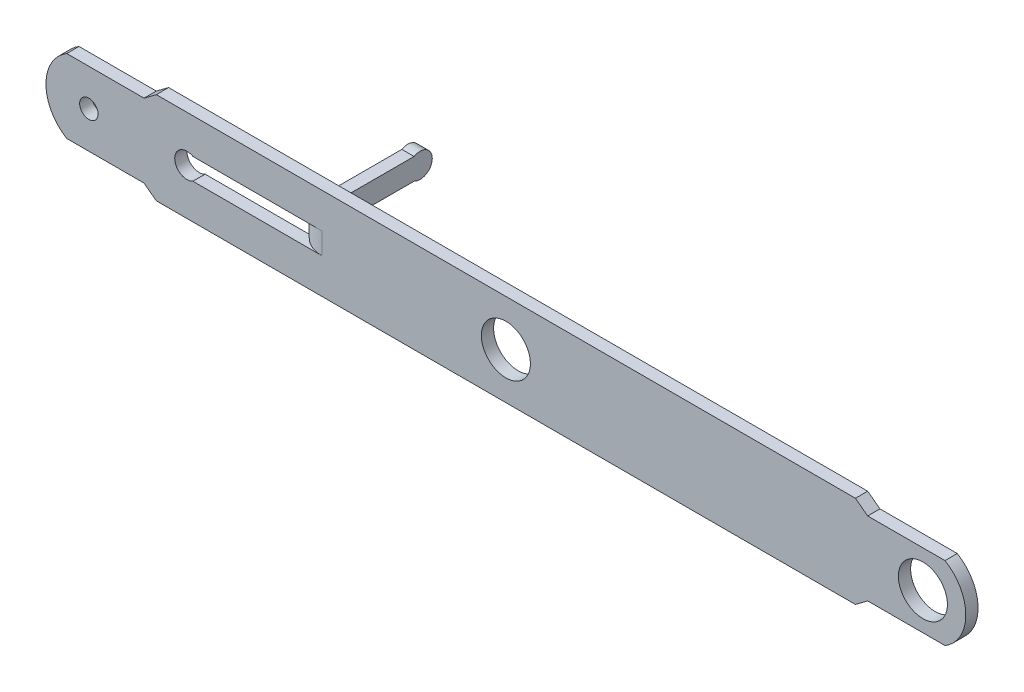
ISO-10303-21;
HEADER;
FILE_DESCRIPTION(('STEP AP214'),'2;1');
FILE_NAME('part.step','',(''),(''),'','','');
FILE_SCHEMA(('AUTOMOTIVE_DESIGN { 1 0 10303 214 1 1 1 1 }'));
ENDSEC;
DATA;
#1=APPLICATION_CONTEXT('core data for automotive mechanical design processes');
#2=APPLICATION_PROTOCOL_DEFINITION('international standard','automotive_design',2000,#1);
#3=PRODUCT_CONTEXT('',#1,'mechanical');
#4=PRODUCT('Part','Part','',(#3));
#5=PRODUCT_RELATED_PRODUCT_CATEGORY('part','',(#4));
#6=PRODUCT_DEFINITION_FORMATION('','',#4);
#7=PRODUCT_DEFINITION_CONTEXT('part definition',#1,'design');
#8=PRODUCT_DEFINITION('design','',#6,#7);
#9=PRODUCT_DEFINITION_SHAPE('','',#8);
#10=(LENGTH_UNIT() NAMED_UNIT(*) SI_UNIT(.MILLI.,.METRE.));
#11=(NAMED_UNIT(*) PLANE_ANGLE_UNIT() SI_UNIT($,.RADIAN.));
#12=(NAMED_UNIT(*) SI_UNIT($,.STERADIAN.) SOLID_ANGLE_UNIT());
#13=UNCERTAINTY_MEASURE_WITH_UNIT(LENGTH_MEASURE(1.E-05),#10,'distance_accuracy_value','');
#14=(GEOMETRIC_REPRESENTATION_CONTEXT(3) GLOBAL_UNCERTAINTY_ASSIGNED_CONTEXT((#13)) GLOBAL_UNIT_ASSIGNED_CONTEXT((#10,
#11,#12)) REPRESENTATION_CONTEXT('',''));
#15=CARTESIAN_POINT('',(0.,0.,0.));
#16=DIRECTION('',(0.,0.,1.));
#17=DIRECTION('',(1.,0.,0.));
#18=AXIS2_PLACEMENT_3D('',#15,#16,#17);
#19=CARTESIAN_POINT('',(-68.,0.,2.));
#20=DIRECTION('',(0.,0.,-1.));
#21=DIRECTION('',(-1.,0.,0.));
#22=AXIS2_PLACEMENT_3D('',#19,#20,#21);
#23=PLANE('',#22);
#24=DIRECTION('',(0.,-1.,0.));
#25=VECTOR('',#24,1.);
#26=CARTESIAN_POINT('',(-30.,0.,2.));
#27=LINE('',#26,#25);
#28=CARTESIAN_POINT('',(-30.,1.75,2.));
#29=VERTEX_POINT('',#28);
#30=CARTESIAN_POINT('',(-30.,-1.75,2.));
#31=VERTEX_POINT('',#30);
#32=EDGE_CURVE('E349',#29,#31,#27,.T.);
#33=ORIENTED_EDGE('',*,*,#32,.T.);
#34=DIRECTION('',(-1.,0.,0.));
#35=VECTOR('',#34,1.);
#36=CARTESIAN_POINT('',(-35.,-1.75,2.));
#37=LINE('',#36,#35);
#38=CARTESIAN_POINT('',(-51.0317541634481,-1.75,2.));
#39=VERTEX_POINT('',#38);
#40=EDGE_CURVE('E220',#31,#39,#37,.T.);
#41=ORIENTED_EDGE('',*,*,#40,.T.);
#42=CARTESIAN_POINT('',(-52.,0.,2.));
#43=DIRECTION('',(0.,0.,-1.));
#44=DIRECTION('',(-1.,0.,0.));
#45=AXIS2_PLACEMENT_3D('',#42,#43,#44);
#46=CIRCLE('',#45,2.);
#47=CARTESIAN_POINT('',(-51.0317541634481,1.75,2.));
#48=VERTEX_POINT('',#47);
#49=EDGE_CURVE('E223',#39,#48,#46,.T.);
#50=ORIENTED_EDGE('',*,*,#49,.T.);
#51=DIRECTION('',(1.,0.,0.));
#52=VECTOR('',#51,1.);
#53=CARTESIAN_POINT('',(-35.,1.75,2.));
#54=LINE('',#53,#52);
#55=EDGE_CURVE('E226',#48,#29,#54,.T.);
#56=ORIENTED_EDGE('',*,*,#55,.T.);
#57=EDGE_LOOP('',(#33,#41,#50,#56));
#58=FACE_BOUND('',#57,.T.);
#59=CARTESIAN_POINT('',(-68.,0.,2.));
#60=DIRECTION('',(0.,0.,1.));
#61=DIRECTION('',(1.,0.,0.));
#62=AXIS2_PLACEMENT_3D('',#59,#60,#61);
#63=CIRCLE('',#62,1.5);
#64=CARTESIAN_POINT('',(-66.5,0.,2.));
#65=VERTEX_POINT('',#64);
#66=EDGE_CURVE('E242',#65,#65,#63,.T.);
#67=ORIENTED_EDGE('',*,*,#66,.F.);
#68=EDGE_LOOP('',(#67));
#69=FACE_BOUND('',#68,.T.);
#70=DIRECTION('',(-1.,0.,0.));
#71=VECTOR('',#70,1.);
#72=CARTESIAN_POINT('',(57.,7.49999999999998,2.));
#73=LINE('',#72,#71);
#74=CARTESIAN_POINT('',(57.,7.49999999999998,2.));
#75=VERTEX_POINT('',#74);
#76=CARTESIAN_POINT('',(-57.,7.49999999999998,2.));
#77=VERTEX_POINT('',#76);
#78=EDGE_CURVE('E278',#75,#77,#73,.T.);
#79=ORIENTED_EDGE('',*,*,#78,.T.);
#80=DIRECTION('',(-0.800000000000002,-0.599999999999997,0.));
#81=VECTOR('',#80,1.);
#82=CARTESIAN_POINT('',(-59.,6.,2.));
#83=LINE('',#82,#81);
#84=CARTESIAN_POINT('',(-59.,6.,2.));
#85=VERTEX_POINT('',#84);
#86=EDGE_CURVE('E281',#77,#85,#83,.T.);
#87=ORIENTED_EDGE('',*,*,#86,.T.);
#88=DIRECTION('',(-1.,0.,0.));
#89=VECTOR('',#88,1.);
#90=CARTESIAN_POINT('',(-71.605551275464,5.99999999999999,2.));
#91=LINE('',#90,#89);
#92=CARTESIAN_POINT('',(-71.605551275464,5.99999999999999,2.));
#93=VERTEX_POINT('',#92);
#94=EDGE_CURVE('E283',#85,#93,#91,.T.);
#95=ORIENTED_EDGE('',*,*,#94,.T.);
#96=CARTESIAN_POINT('',(-68.,0.,2.));
#97=DIRECTION('',(0.,0.,1.));
#98=DIRECTION('',(-1.,0.,0.));
#99=AXIS2_PLACEMENT_3D('',#96,#97,#98);
#100=CIRCLE('',#99,7.);
#101=CARTESIAN_POINT('',(-71.605551275464,-5.99999999999999,2.));
#102=VERTEX_POINT('',#101);
#103=EDGE_CURVE('E285',#93,#102,#100,.T.);
#104=ORIENTED_EDGE('',*,*,#103,.T.);
#105=DIRECTION('',(1.,0.,0.));
#106=VECTOR('',#105,1.);
#107=CARTESIAN_POINT('',(-71.605551275464,-5.99999999999999,2.));
#108=LINE('',#107,#106);
#109=CARTESIAN_POINT('',(-59.,-6.,2.));
#110=VERTEX_POINT('',#109);
#111=EDGE_CURVE('E287',#102,#110,#108,.T.);
#112=ORIENTED_EDGE('',*,*,#111,.T.);
#113=DIRECTION('',(0.800000000000002,-0.599999999999997,0.));
#114=VECTOR('',#113,1.);
#115=CARTESIAN_POINT('',(-59.,-6.,2.));
#116=LINE('',#115,#114);
#117=CARTESIAN_POINT('',(-57.,-7.49999999999998,2.));
#118=VERTEX_POINT('',#117);
#119=EDGE_CURVE('E289',#110,#118,#116,.T.);
#120=ORIENTED_EDGE('',*,*,#119,.T.);
#121=DIRECTION('',(1.,0.,0.));
#122=VECTOR('',#121,1.);
#123=CARTESIAN_POINT('',(57.,-7.49999999999998,2.));
#124=LINE('',#123,#122);
#125=CARTESIAN_POINT('',(57.,-7.49999999999998,2.));
#126=VERTEX_POINT('',#125);
#127=EDGE_CURVE('E291',#118,#126,#124,.T.);
#128=ORIENTED_EDGE('',*,*,#127,.T.);
#129=DIRECTION('',(0.800000000000002,0.599999999999997,0.));
#130=VECTOR('',#129,1.);
#131=CARTESIAN_POINT('',(59.,-6.,2.));
#132=LINE('',#131,#130);
#133=CARTESIAN_POINT('',(59.,-6.,2.));
#134=VERTEX_POINT('',#133);
#135=EDGE_CURVE('E293',#126,#134,#132,.T.);
#136=ORIENTED_EDGE('',*,*,#135,.T.);
#137=DIRECTION('',(1.,0.,0.));
#138=VECTOR('',#137,1.);
#139=CARTESIAN_POINT('',(71.605551275464,-5.99999999999999,2.));
#140=LINE('',#139,#138);
#141=CARTESIAN_POINT('',(71.605551275464,-6.,2.));
#142=VERTEX_POINT('',#141);
#143=EDGE_CURVE('E295',#134,#142,#140,.T.);
#144=ORIENTED_EDGE('',*,*,#143,.T.);
#145=CARTESIAN_POINT('',(68.,0.,2.));
#146=DIRECTION('',(0.,0.,1.));
#147=DIRECTION('',(1.,0.,0.));
#148=AXIS2_PLACEMENT_3D('',#145,#146,#147);
#149=CIRCLE('',#148,7.);
#150=CARTESIAN_POINT('',(71.605551275464,5.99999999999999,2.));
#151=VERTEX_POINT('',#150);
#152=EDGE_CURVE('E297',#142,#151,#149,.T.);
#153=ORIENTED_EDGE('',*,*,#152,.T.);
#154=DIRECTION('',(-1.,0.,0.));
#155=VECTOR('',#154,1.);
#156=CARTESIAN_POINT('',(71.605551275464,5.99999999999999,2.));
#157=LINE('',#156,#155);
#158=CARTESIAN_POINT('',(59.,6.,2.));
#159=VERTEX_POINT('',#158);
#160=EDGE_CURVE('E299',#151,#159,#157,.T.);
#161=ORIENTED_EDGE('',*,*,#160,.T.);
#162=DIRECTION('',(-0.800000000000002,0.599999999999997,0.));
#163=VECTOR('',#162,1.);
#164=CARTESIAN_POINT('',(59.,6.,2.));
#165=LINE('',#164,#163);
#166=EDGE_CURVE('E301',#159,#75,#165,.T.);
#167=ORIENTED_EDGE('',*,*,#166,.T.);
#168=EDGE_LOOP('',(#79,#87,#95,#104,#112,#120,#128,#136,#144,#153,#161,#167));
#169=FACE_BOUND('',#168,.T.);
#170=CARTESIAN_POINT('',(68.,0.,2.));
#171=DIRECTION('',(0.,0.,1.));
#172=DIRECTION('',(1.,0.,0.));
#173=AXIS2_PLACEMENT_3D('',#170,#171,#172);
#174=CIRCLE('',#173,4.00000000000001);
#175=CARTESIAN_POINT('',(72.,0.,2.));
#176=VERTEX_POINT('',#175);
#177=EDGE_CURVE('E249',#176,#176,#174,.T.);
#178=ORIENTED_EDGE('',*,*,#177,.F.);
#179=EDGE_LOOP('',(#178));
#180=FACE_BOUND('',#179,.T.);
#181=CARTESIAN_POINT('',(0.,0.,2.));
#182=DIRECTION('',(0.,0.,1.));
#183=DIRECTION('',(1.,0.,0.));
#184=AXIS2_PLACEMENT_3D('',#181,#182,#183);
#185=CIRCLE('',#184,4.);
#186=CARTESIAN_POINT('',(4.,0.,2.));
#187=VERTEX_POINT('',#186);
#188=EDGE_CURVE('E236',#187,#187,#185,.T.);
#189=ORIENTED_EDGE('',*,*,#188,.F.);
#190=EDGE_LOOP('',(#189));
#191=FACE_BOUND('',#190,.T.);
#192=ADVANCED_FACE('F35',(#58,#69,#169,#180,#191),#23,.F.);
#193=CARTESIAN_POINT('',(-68.,0.,0.));
#194=DIRECTION('',(0.,0.,-1.));
#195=DIRECTION('',(-1.,0.,0.));
#196=AXIS2_PLACEMENT_3D('',#193,#194,#195);
#197=PLANE('',#196);
#198=DIRECTION('',(0.,1.,0.));
#199=VECTOR('',#198,1.);
#200=CARTESIAN_POINT('',(-30.,0.,0.));
#201=LINE('',#200,#199);
#202=CARTESIAN_POINT('',(-30.,-1.75,0.));
#203=VERTEX_POINT('',#202);
#204=CARTESIAN_POINT('',(-30.,1.75,0.));
#205=VERTEX_POINT('',#204);
#206=EDGE_CURVE('E339',#203,#205,#201,.T.);
#207=ORIENTED_EDGE('',*,*,#206,.T.);
#208=DIRECTION('',(1.,0.,0.));
#209=VECTOR('',#208,1.);
#210=CARTESIAN_POINT('',(-68.,1.75,0.));
#211=LINE('',#210,#209);
#212=CARTESIAN_POINT('',(-34.,1.75,0.));
#213=VERTEX_POINT('',#212);
#214=EDGE_CURVE('E209',#213,#205,#211,.T.);
#215=ORIENTED_EDGE('',*,*,#214,.F.);
#216=DIRECTION('',(1.,0.,0.));
#217=VECTOR('',#216,1.);
#218=CARTESIAN_POINT('',(-35.,1.75,0.));
#219=LINE('',#218,#217);
#220=CARTESIAN_POINT('',(-51.0317541634481,1.75,0.));
#221=VERTEX_POINT('',#220);
#222=EDGE_CURVE('E218',#221,#213,#219,.T.);
#223=ORIENTED_EDGE('',*,*,#222,.F.);
#224=CARTESIAN_POINT('',(-52.,0.,0.));
#225=DIRECTION('',(0.,0.,-1.));
#226=DIRECTION('',(-1.,0.,0.));
#227=AXIS2_PLACEMENT_3D('',#224,#225,#226);
#228=CIRCLE('',#227,2.);
#229=CARTESIAN_POINT('',(-51.0317541634481,-1.75,0.));
#230=VERTEX_POINT('',#229);
#231=EDGE_CURVE('E215',#230,#221,#228,.T.);
#232=ORIENTED_EDGE('',*,*,#231,.F.);
#233=DIRECTION('',(-1.,0.,0.));
#234=VECTOR('',#233,1.);
#235=CARTESIAN_POINT('',(-35.,-1.75,0.));
#236=LINE('',#235,#234);
#237=CARTESIAN_POINT('',(-34.,-1.75,0.));
#238=VERTEX_POINT('',#237);
#239=EDGE_CURVE('E50',#238,#230,#236,.T.);
#240=ORIENTED_EDGE('',*,*,#239,.F.);
#241=DIRECTION('',(-1.,0.,0.));
#242=VECTOR('',#241,1.);
#243=CARTESIAN_POINT('',(-68.,-1.75,0.));
#244=LINE('',#243,#242);
#245=EDGE_CURVE('E212',#203,#238,#244,.T.);
#246=ORIENTED_EDGE('',*,*,#245,.F.);
#247=EDGE_LOOP('',(#207,#215,#223,#232,#240,#246));
#248=FACE_BOUND('',#247,.T.);
#249=CARTESIAN_POINT('',(-68.,0.,0.));
#250=DIRECTION('',(0.,0.,1.));
#251=DIRECTION('',(1.,0.,0.));
#252=AXIS2_PLACEMENT_3D('',#249,#250,#251);
#253=CIRCLE('',#252,1.5);
#254=CARTESIAN_POINT('',(-66.5,0.,0.));
#255=VERTEX_POINT('',#254);
#256=EDGE_CURVE('E239',#255,#255,#253,.T.);
#257=ORIENTED_EDGE('',*,*,#256,.T.);
#258=EDGE_LOOP('',(#257));
#259=FACE_BOUND('',#258,.T.);
#260=DIRECTION('',(-1.,0.,0.));
#261=VECTOR('',#260,1.);
#262=CARTESIAN_POINT('',(57.,7.49999999999998,0.));
#263=LINE('',#262,#261);
#264=CARTESIAN_POINT('',(57.,7.49999999999998,0.));
#265=VERTEX_POINT('',#264);
#266=CARTESIAN_POINT('',(-57.,7.49999999999998,0.));
#267=VERTEX_POINT('',#266);
#268=EDGE_CURVE('E253',#265,#267,#263,.T.);
#269=ORIENTED_EDGE('',*,*,#268,.F.);
#270=DIRECTION('',(-0.800000000000002,0.599999999999997,0.));
#271=VECTOR('',#270,1.);
#272=CARTESIAN_POINT('',(59.,6.,0.));
#273=LINE('',#272,#271);
#274=CARTESIAN_POINT('',(59.,6.,0.));
#275=VERTEX_POINT('',#274);
#276=EDGE_CURVE('E276',#275,#265,#273,.T.);
#277=ORIENTED_EDGE('',*,*,#276,.F.);
#278=DIRECTION('',(-1.,0.,0.));
#279=VECTOR('',#278,1.);
#280=CARTESIAN_POINT('',(71.605551275464,5.99999999999999,0.));
#281=LINE('',#280,#279);
#282=CARTESIAN_POINT('',(71.605551275464,5.99999999999999,0.));
#283=VERTEX_POINT('',#282);
#284=EDGE_CURVE('E274',#283,#275,#281,.T.);
#285=ORIENTED_EDGE('',*,*,#284,.F.);
#286=CARTESIAN_POINT('',(68.,0.,0.));
#287=DIRECTION('',(0.,0.,1.));
#288=DIRECTION('',(1.,0.,0.));
#289=AXIS2_PLACEMENT_3D('',#286,#287,#288);
#290=CIRCLE('',#289,7.);
#291=CARTESIAN_POINT('',(71.605551275464,-6.,0.));
#292=VERTEX_POINT('',#291);
#293=EDGE_CURVE('E272',#292,#283,#290,.T.);
#294=ORIENTED_EDGE('',*,*,#293,.F.);
#295=DIRECTION('',(1.,0.,0.));
#296=VECTOR('',#295,1.);
#297=CARTESIAN_POINT('',(71.605551275464,-5.99999999999999,0.));
#298=LINE('',#297,#296);
#299=CARTESIAN_POINT('',(59.,-6.,0.));
#300=VERTEX_POINT('',#299);
#301=EDGE_CURVE('E270',#300,#292,#298,.T.);
#302=ORIENTED_EDGE('',*,*,#301,.F.);
#303=DIRECTION('',(0.800000000000002,0.599999999999997,0.));
#304=VECTOR('',#303,1.);
#305=CARTESIAN_POINT('',(59.,-6.,0.));
#306=LINE('',#305,#304);
#307=CARTESIAN_POINT('',(57.,-7.49999999999998,0.));
#308=VERTEX_POINT('',#307);
#309=EDGE_CURVE('E268',#308,#300,#306,.T.);
#310=ORIENTED_EDGE('',*,*,#309,.F.);
#311=DIRECTION('',(1.,0.,0.));
#312=VECTOR('',#311,1.);
#313=CARTESIAN_POINT('',(57.,-7.49999999999998,0.));
#314=LINE('',#313,#312);
#315=CARTESIAN_POINT('',(-57.,-7.49999999999998,0.));
#316=VERTEX_POINT('',#315);
#317=EDGE_CURVE('E266',#316,#308,#314,.T.);
#318=ORIENTED_EDGE('',*,*,#317,.F.);
#319=DIRECTION('',(0.800000000000002,-0.599999999999997,0.));
#320=VECTOR('',#319,1.);
#321=CARTESIAN_POINT('',(-59.,-6.,0.));
#322=LINE('',#321,#320);
#323=CARTESIAN_POINT('',(-59.,-6.,0.));
#324=VERTEX_POINT('',#323);
#325=EDGE_CURVE('E264',#324,#316,#322,.T.);
#326=ORIENTED_EDGE('',*,*,#325,.F.);
#327=DIRECTION('',(1.,0.,0.));
#328=VECTOR('',#327,1.);
#329=CARTESIAN_POINT('',(-71.605551275464,-5.99999999999999,0.));
#330=LINE('',#329,#328);
#331=CARTESIAN_POINT('',(-71.605551275464,-5.99999999999999,0.));
#332=VERTEX_POINT('',#331);
#333=EDGE_CURVE('E262',#332,#324,#330,.T.);
#334=ORIENTED_EDGE('',*,*,#333,.F.);
#335=CARTESIAN_POINT('',(-68.,0.,0.));
#336=DIRECTION('',(0.,0.,1.));
#337=DIRECTION('',(-1.,0.,0.));
#338=AXIS2_PLACEMENT_3D('',#335,#336,#337);
#339=CIRCLE('',#338,7.);
#340=CARTESIAN_POINT('',(-71.605551275464,5.99999999999999,0.));
#341=VERTEX_POINT('',#340);
#342=EDGE_CURVE('E260',#341,#332,#339,.T.);
#343=ORIENTED_EDGE('',*,*,#342,.F.);
#344=DIRECTION('',(-1.,0.,0.));
#345=VECTOR('',#344,1.);
#346=CARTESIAN_POINT('',(-71.605551275464,5.99999999999999,0.));
#347=LINE('',#346,#345);
#348=CARTESIAN_POINT('',(-59.,6.,0.));
#349=VERTEX_POINT('',#348);
#350=EDGE_CURVE('E258',#349,#341,#347,.T.);
#351=ORIENTED_EDGE('',*,*,#350,.F.);
#352=DIRECTION('',(-0.800000000000002,-0.599999999999997,0.));
#353=VECTOR('',#352,1.);
#354=CARTESIAN_POINT('',(-59.,6.,0.));
#355=LINE('',#354,#353);
#356=EDGE_CURVE('E256',#267,#349,#355,.T.);
#357=ORIENTED_EDGE('',*,*,#356,.F.);
#358=EDGE_LOOP('',(#269,#277,#285,#294,#302,#310,#318,#326,#334,#343,#351,#357));
#359=FACE_BOUND('',#358,.T.);
#360=CARTESIAN_POINT('',(68.,0.,0.));
#361=DIRECTION('',(0.,0.,1.));
#362=DIRECTION('',(1.,0.,0.));
#363=AXIS2_PLACEMENT_3D('',#360,#361,#362);
#364=CIRCLE('',#363,4.00000000000001);
#365=CARTESIAN_POINT('',(72.,0.,0.));
#366=VERTEX_POINT('',#365);
#367=EDGE_CURVE('E245',#366,#366,#364,.T.);
#368=ORIENTED_EDGE('',*,*,#367,.T.);
#369=EDGE_LOOP('',(#368));
#370=FACE_BOUND('',#369,.T.);
#371=CARTESIAN_POINT('',(0.,0.,0.));
#372=DIRECTION('',(0.,0.,1.));
#373=DIRECTION('',(1.,0.,0.));
#374=AXIS2_PLACEMENT_3D('',#371,#372,#373);
#375=CIRCLE('',#374,4.);
#376=CARTESIAN_POINT('',(4.,0.,0.));
#377=VERTEX_POINT('',#376);
#378=EDGE_CURVE('E231',#377,#377,#375,.T.);
#379=ORIENTED_EDGE('',*,*,#378,.T.);
#380=EDGE_LOOP('',(#379));
#381=FACE_BOUND('',#380,.T.);
#382=ADVANCED_FACE('F369',(#248,#259,#359,#370,#381),#197,.T.);
#383=CARTESIAN_POINT('',(57.,7.49999999999998,2.));
#384=DIRECTION('',(0.,-1.,0.));
#385=DIRECTION('',(0.,0.,-1.));
#386=AXIS2_PLACEMENT_3D('',#383,#384,#385);
#387=PLANE('',#386);
#388=ORIENTED_EDGE('',*,*,#268,.T.);
#389=DIRECTION('',(0.,0.,-1.));
#390=VECTOR('',#389,1.);
#391=CARTESIAN_POINT('',(-57.,7.49999999999998,2.));
#392=LINE('',#391,#390);
#393=EDGE_CURVE('E336',#77,#267,#392,.T.);
#394=ORIENTED_EDGE('',*,*,#393,.F.);
#395=ORIENTED_EDGE('',*,*,#78,.F.);
#396=DIRECTION('',(0.,0.,-1.));
#397=VECTOR('',#396,1.);
#398=CARTESIAN_POINT('',(57.,7.49999999999998,2.));
#399=LINE('',#398,#397);
#400=EDGE_CURVE('E303',#75,#265,#399,.T.);
#401=ORIENTED_EDGE('',*,*,#400,.T.);
#402=EDGE_LOOP('',(#388,#394,#395,#401));
#403=FACE_BOUND('',#402,.T.);
#404=ADVANCED_FACE('F37',(#403),#387,.F.);
#405=CARTESIAN_POINT('',(-59.,6.,2.));
#406=DIRECTION('',(0.599999999999997,-0.800000000000002,0.));
#407=DIRECTION('',(0.800000000000002,0.599999999999997,0.));
#408=AXIS2_PLACEMENT_3D('',#405,#406,#407);
#409=PLANE('',#408);
#410=ORIENTED_EDGE('',*,*,#356,.T.);
#411=DIRECTION('',(0.,0.,-1.));
#412=VECTOR('',#411,1.);
#413=CARTESIAN_POINT('',(-59.,6.,2.));
#414=LINE('',#413,#412);
#415=EDGE_CURVE('E333',#85,#349,#414,.T.);
#416=ORIENTED_EDGE('',*,*,#415,.F.);
#417=ORIENTED_EDGE('',*,*,#86,.F.);
#418=ORIENTED_EDGE('',*,*,#393,.T.);
#419=EDGE_LOOP('',(#410,#416,#417,#418));
#420=FACE_BOUND('',#419,.T.);
#421=ADVANCED_FACE('F439',(#420),#409,.F.);
#422=CARTESIAN_POINT('',(-71.605551275464,5.99999999999999,2.));
#423=DIRECTION('',(0.,-1.,0.));
#424=DIRECTION('',(1.,0.,0.));
#425=AXIS2_PLACEMENT_3D('',#422,#423,#424);
#426=PLANE('',#425);
#427=ORIENTED_EDGE('',*,*,#350,.T.);
#428=DIRECTION('',(0.,0.,-1.));
#429=VECTOR('',#428,1.);
#430=CARTESIAN_POINT('',(-71.605551275464,5.99999999999999,2.));
#431=LINE('',#430,#429);
#432=EDGE_CURVE('E330',#93,#341,#431,.T.);
#433=ORIENTED_EDGE('',*,*,#432,.F.);
#434=ORIENTED_EDGE('',*,*,#94,.F.);
#435=ORIENTED_EDGE('',*,*,#415,.T.);
#436=EDGE_LOOP('',(#427,#433,#434,#435));
#437=FACE_BOUND('',#436,.T.);
#438=ADVANCED_FACE('F436',(#437),#426,.F.);
#439=CARTESIAN_POINT('',(-68.,0.,2.));
#440=DIRECTION('',(0.,0.,-1.));
#441=DIRECTION('',(-1.,0.,0.));
#442=AXIS2_PLACEMENT_3D('',#439,#440,#441);
#443=CYLINDRICAL_SURFACE('',#442,7.);
#444=ORIENTED_EDGE('',*,*,#342,.T.);
#445=DIRECTION('',(0.,0.,-1.));
#446=VECTOR('',#445,1.);
#447=CARTESIAN_POINT('',(-71.605551275464,-5.99999999999999,2.));
#448=LINE('',#447,#446);
#449=EDGE_CURVE('E327',#102,#332,#448,.T.);
#450=ORIENTED_EDGE('',*,*,#449,.F.);
#451=ORIENTED_EDGE('',*,*,#103,.F.);
#452=ORIENTED_EDGE('',*,*,#432,.T.);
#453=EDGE_LOOP('',(#444,#450,#451,#452));
#454=FACE_BOUND('',#453,.T.);
#455=ADVANCED_FACE('F432',(#454),#443,.T.);
#456=CARTESIAN_POINT('',(-71.605551275464,-5.99999999999999,2.));
#457=DIRECTION('',(0.,1.,0.));
#458=DIRECTION('',(-1.,0.,0.));
#459=AXIS2_PLACEMENT_3D('',#456,#457,#458);
#460=PLANE('',#459);
#461=ORIENTED_EDGE('',*,*,#333,.T.);
#462=DIRECTION('',(0.,0.,-1.));
#463=VECTOR('',#462,1.);
#464=CARTESIAN_POINT('',(-59.,-6.,2.));
#465=LINE('',#464,#463);
#466=EDGE_CURVE('E324',#110,#324,#465,.T.);
#467=ORIENTED_EDGE('',*,*,#466,.F.);
#468=ORIENTED_EDGE('',*,*,#111,.F.);
#469=ORIENTED_EDGE('',*,*,#449,.T.);
#470=EDGE_LOOP('',(#461,#467,#468,#469));
#471=FACE_BOUND('',#470,.T.);
#472=ADVANCED_FACE('F428',(#471),#460,.F.);
#473=CARTESIAN_POINT('',(-59.,-6.,2.));
#474=DIRECTION('',(0.599999999999997,0.800000000000002,0.));
#475=DIRECTION('',(-0.800000000000002,0.599999999999997,0.));
#476=AXIS2_PLACEMENT_3D('',#473,#474,#475);
#477=PLANE('',#476);
#478=ORIENTED_EDGE('',*,*,#325,.T.);
#479=DIRECTION('',(0.,0.,-1.));
#480=VECTOR('',#479,1.);
#481=CARTESIAN_POINT('',(-57.,-7.49999999999998,2.));
#482=LINE('',#481,#480);
#483=EDGE_CURVE('E321',#118,#316,#482,.T.);
#484=ORIENTED_EDGE('',*,*,#483,.F.);
#485=ORIENTED_EDGE('',*,*,#119,.F.);
#486=ORIENTED_EDGE('',*,*,#466,.T.);
#487=EDGE_LOOP('',(#478,#484,#485,#486));
#488=FACE_BOUND('',#487,.T.);
#489=ADVANCED_FACE('F424',(#488),#477,.F.);
#490=CARTESIAN_POINT('',(57.,-7.49999999999998,2.));
#491=DIRECTION('',(0.,1.,0.));
#492=DIRECTION('',(0.,0.,1.));
#493=AXIS2_PLACEMENT_3D('',#490,#491,#492);
#494=PLANE('',#493);
#495=ORIENTED_EDGE('',*,*,#317,.T.);
#496=DIRECTION('',(0.,0.,-1.));
#497=VECTOR('',#496,1.);
#498=CARTESIAN_POINT('',(57.,-7.49999999999998,2.));
#499=LINE('',#498,#497);
#500=EDGE_CURVE('E318',#126,#308,#499,.T.);
#501=ORIENTED_EDGE('',*,*,#500,.F.);
#502=ORIENTED_EDGE('',*,*,#127,.F.);
#503=ORIENTED_EDGE('',*,*,#483,.T.);
#504=EDGE_LOOP('',(#495,#501,#502,#503));
#505=FACE_BOUND('',#504,.T.);
#506=ADVANCED_FACE('F420',(#505),#494,.F.);
#507=CARTESIAN_POINT('',(59.,-6.,2.));
#508=DIRECTION('',(-0.599999999999997,0.800000000000002,0.));
#509=DIRECTION('',(-0.800000000000002,-0.599999999999997,0.));
#510=AXIS2_PLACEMENT_3D('',#507,#508,#509);
#511=PLANE('',#510);
#512=ORIENTED_EDGE('',*,*,#309,.T.);
#513=DIRECTION('',(0.,0.,-1.));
#514=VECTOR('',#513,1.);
#515=CARTESIAN_POINT('',(59.,-6.,2.));
#516=LINE('',#515,#514);
#517=EDGE_CURVE('E315',#134,#300,#516,.T.);
#518=ORIENTED_EDGE('',*,*,#517,.F.);
#519=ORIENTED_EDGE('',*,*,#135,.F.);
#520=ORIENTED_EDGE('',*,*,#500,.T.);
#521=EDGE_LOOP('',(#512,#518,#519,#520));
#522=FACE_BOUND('',#521,.T.);
#523=ADVANCED_FACE('F416',(#522),#511,.F.);
#524=CARTESIAN_POINT('',(71.605551275464,-5.99999999999999,2.));
#525=DIRECTION('',(0.,1.,0.));
#526=DIRECTION('',(-1.,0.,0.));
#527=AXIS2_PLACEMENT_3D('',#524,#525,#526);
#528=PLANE('',#527);
#529=ORIENTED_EDGE('',*,*,#301,.T.);
#530=DIRECTION('',(0.,0.,-1.));
#531=VECTOR('',#530,1.);
#532=CARTESIAN_POINT('',(71.605551275464,-6.,2.));
#533=LINE('',#532,#531);
#534=EDGE_CURVE('E312',#142,#292,#533,.T.);
#535=ORIENTED_EDGE('',*,*,#534,.F.);
#536=ORIENTED_EDGE('',*,*,#143,.F.);
#537=ORIENTED_EDGE('',*,*,#517,.T.);
#538=EDGE_LOOP('',(#529,#535,#536,#537));
#539=FACE_BOUND('',#538,.T.);
#540=ADVANCED_FACE('F412',(#539),#528,.F.);
#541=CARTESIAN_POINT('',(68.,0.,2.));
#542=DIRECTION('',(0.,0.,-1.));
#543=DIRECTION('',(-1.,0.,0.));
#544=AXIS2_PLACEMENT_3D('',#541,#542,#543);
#545=CYLINDRICAL_SURFACE('',#544,7.);
#546=ORIENTED_EDGE('',*,*,#293,.T.);
#547=DIRECTION('',(0.,0.,-1.));
#548=VECTOR('',#547,1.);
#549=CARTESIAN_POINT('',(71.605551275464,5.99999999999999,2.));
#550=LINE('',#549,#548);
#551=EDGE_CURVE('E309',#151,#283,#550,.T.);
#552=ORIENTED_EDGE('',*,*,#551,.F.);
#553=ORIENTED_EDGE('',*,*,#152,.F.);
#554=ORIENTED_EDGE('',*,*,#534,.T.);
#555=EDGE_LOOP('',(#546,#552,#553,#554));
#556=FACE_BOUND('',#555,.T.);
#557=ADVANCED_FACE('F408',(#556),#545,.T.);
#558=CARTESIAN_POINT('',(71.605551275464,5.99999999999999,2.));
#559=DIRECTION('',(0.,-1.,0.));
#560=DIRECTION('',(1.,0.,0.));
#561=AXIS2_PLACEMENT_3D('',#558,#559,#560);
#562=PLANE('',#561);
#563=ORIENTED_EDGE('',*,*,#284,.T.);
#564=DIRECTION('',(0.,0.,-1.));
#565=VECTOR('',#564,1.);
#566=CARTESIAN_POINT('',(59.,6.,2.));
#567=LINE('',#566,#565);
#568=EDGE_CURVE('E306',#159,#275,#567,.T.);
#569=ORIENTED_EDGE('',*,*,#568,.F.);
#570=ORIENTED_EDGE('',*,*,#160,.F.);
#571=ORIENTED_EDGE('',*,*,#551,.T.);
#572=EDGE_LOOP('',(#563,#569,#570,#571));
#573=FACE_BOUND('',#572,.T.);
#574=ADVANCED_FACE('F404',(#573),#562,.F.);
#575=CARTESIAN_POINT('',(59.,6.,2.));
#576=DIRECTION('',(-0.599999999999997,-0.800000000000002,0.));
#577=DIRECTION('',(0.800000000000002,-0.599999999999997,0.));
#578=AXIS2_PLACEMENT_3D('',#575,#576,#577);
#579=PLANE('',#578);
#580=ORIENTED_EDGE('',*,*,#276,.T.);
#581=ORIENTED_EDGE('',*,*,#400,.F.);
#582=ORIENTED_EDGE('',*,*,#166,.F.);
#583=ORIENTED_EDGE('',*,*,#568,.T.);
#584=EDGE_LOOP('',(#580,#581,#582,#583));
#585=FACE_BOUND('',#584,.T.);
#586=ADVANCED_FACE('F400',(#585),#579,.F.);
#587=CARTESIAN_POINT('',(68.,0.,2.));
#588=DIRECTION('',(0.,0.,-1.));
#589=DIRECTION('',(-1.,0.,0.));
#590=AXIS2_PLACEMENT_3D('',#587,#588,#589);
#591=CYLINDRICAL_SURFACE('',#590,4.00000000000001);
#592=ORIENTED_EDGE('',*,*,#177,.T.);
#593=EDGE_LOOP('',(#592));
#594=FACE_BOUND('',#593,.T.);
#595=ORIENTED_EDGE('',*,*,#367,.F.);
#596=EDGE_LOOP('',(#595));
#597=FACE_BOUND('',#596,.T.);
#598=ADVANCED_FACE('F403',(#594,#597),#591,.F.);
#599=CARTESIAN_POINT('',(-68.,0.,2.));
#600=DIRECTION('',(0.,0.,-1.));
#601=DIRECTION('',(-1.,0.,0.));
#602=AXIS2_PLACEMENT_3D('',#599,#600,#601);
#603=CYLINDRICAL_SURFACE('',#602,1.5);
#604=ORIENTED_EDGE('',*,*,#66,.T.);
#605=EDGE_LOOP('',(#604));
#606=FACE_BOUND('',#605,.T.);
#607=ORIENTED_EDGE('',*,*,#256,.F.);
#608=EDGE_LOOP('',(#607));
#609=FACE_BOUND('',#608,.T.);
#610=ADVANCED_FACE('F492',(#606,#609),#603,.F.);
#611=CARTESIAN_POINT('',(0.,0.,2.));
#612=DIRECTION('',(0.,0.,-1.));
#613=DIRECTION('',(-1.,0.,0.));
#614=AXIS2_PLACEMENT_3D('',#611,#612,#613);
#615=CYLINDRICAL_SURFACE('',#614,4.);
#616=ORIENTED_EDGE('',*,*,#188,.T.);
#617=EDGE_LOOP('',(#616));
#618=FACE_BOUND('',#617,.T.);
#619=ORIENTED_EDGE('',*,*,#378,.F.);
#620=EDGE_LOOP('',(#619));
#621=FACE_BOUND('',#620,.T.);
#622=ADVANCED_FACE('F489',(#618,#621),#615,.F.);
#623=CARTESIAN_POINT('',(-35.,1.75,2.));
#624=DIRECTION('',(1.,0.,0.));
#625=DIRECTION('',(0.,0.,-1.));
#626=AXIS2_PLACEMENT_3D('',#623,#624,#625);
#627=PLANE('',#626);
#628=DIRECTION('',(0.,0.,1.));
#629=VECTOR('',#628,1.);
#630=CARTESIAN_POINT('',(-35.,-1.75,2.));
#631=LINE('',#630,#629);
#632=CARTESIAN_POINT('',(-35.,-1.75,-16.0317541634481));
#633=VERTEX_POINT('',#632);
#634=CARTESIAN_POINT('',(-35.,-1.75,-3.));
#635=VERTEX_POINT('',#634);
#636=EDGE_CURVE('E200',#633,#635,#631,.T.);
#637=ORIENTED_EDGE('',*,*,#636,.T.);
#638=DIRECTION('',(0.,-1.,0.));
#639=VECTOR('',#638,1.);
#640=CARTESIAN_POINT('',(-35.,1.75,-3.));
#641=LINE('',#640,#639);
#642=CARTESIAN_POINT('',(-35.,1.75,-3.));
#643=VERTEX_POINT('',#642);
#644=EDGE_CURVE('E183',#635,#643,#641,.F.);
#645=ORIENTED_EDGE('',*,*,#644,.T.);
#646=DIRECTION('',(0.,0.,-1.));
#647=VECTOR('',#646,1.);
#648=CARTESIAN_POINT('',(-35.,1.75,2.));
#649=LINE('',#648,#647);
#650=CARTESIAN_POINT('',(-35.,1.75,-16.0317541634482));
#651=VERTEX_POINT('',#650);
#652=EDGE_CURVE('E175',#643,#651,#649,.T.);
#653=ORIENTED_EDGE('',*,*,#652,.T.);
#654=CARTESIAN_POINT('',(-35.,0.,-17.));
#655=DIRECTION('',(-1.,0.,0.));
#656=DIRECTION('',(0.,0.,1.));
#657=AXIS2_PLACEMENT_3D('',#654,#655,#656);
#658=CIRCLE('',#657,2.);
#659=EDGE_CURVE('E180',#651,#633,#658,.T.);
#660=ORIENTED_EDGE('',*,*,#659,.T.);
#661=EDGE_LOOP('',(#637,#645,#653,#660));
#662=FACE_BOUND('',#661,.T.);
#663=ADVANCED_FACE('F178',(#662),#627,.F.);
#664=CARTESIAN_POINT('',(-35.,1.75,2.));
#665=DIRECTION('',(0.,1.,0.));
#666=DIRECTION('',(0.,0.,1.));
#667=AXIS2_PLACEMENT_3D('',#664,#665,#666);
#668=PLANE('',#667);
#669=ORIENTED_EDGE('',*,*,#222,.T.);
#670=CARTESIAN_POINT('',(-30.,1.75,-3.));
#671=DIRECTION('',(0.,1.,0.));
#672=DIRECTION('',(0.,0.,1.));
#673=AXIS2_PLACEMENT_3D('',#670,#671,#672);
#674=CIRCLE('',#673,5.);
#675=EDGE_CURVE('E11',#213,#29,#674,.T.);
#676=ORIENTED_EDGE('',*,*,#675,.T.);
#677=ORIENTED_EDGE('',*,*,#55,.F.);
#678=DIRECTION('',(0.,0.,-1.));
#679=VECTOR('',#678,1.);
#680=CARTESIAN_POINT('',(-51.0317541634481,1.75,2.));
#681=LINE('',#680,#679);
#682=EDGE_CURVE('E229',#48,#221,#681,.T.);
#683=ORIENTED_EDGE('',*,*,#682,.T.);
#684=EDGE_LOOP('',(#669,#676,#677,#683));
#685=FACE_BOUND('',#684,.T.);
#686=ADVANCED_FACE('F500',(#685),#668,.F.);
#687=CARTESIAN_POINT('',(-52.,0.,2.));
#688=DIRECTION('',(0.,0.,-1.));
#689=DIRECTION('',(-1.,0.,0.));
#690=AXIS2_PLACEMENT_3D('',#687,#688,#689);
#691=CYLINDRICAL_SURFACE('',#690,2.);
#692=ORIENTED_EDGE('',*,*,#231,.T.);
#693=ORIENTED_EDGE('',*,*,#682,.F.);
#694=ORIENTED_EDGE('',*,*,#49,.F.);
#695=DIRECTION('',(0.,0.,-1.));
#696=VECTOR('',#695,1.);
#697=CARTESIAN_POINT('',(-51.0317541634481,-1.75,2.));
#698=LINE('',#697,#696);
#699=EDGE_CURVE('E228',#39,#230,#698,.T.);
#700=ORIENTED_EDGE('',*,*,#699,.T.);
#701=EDGE_LOOP('',(#692,#693,#694,#700));
#702=FACE_BOUND('',#701,.T.);
#703=ADVANCED_FACE('F536',(#702),#691,.F.);
#704=CARTESIAN_POINT('',(-35.,-1.75,2.));
#705=DIRECTION('',(0.,-1.,0.));
#706=DIRECTION('',(0.,0.,-1.));
#707=AXIS2_PLACEMENT_3D('',#704,#705,#706);
#708=PLANE('',#707);
#709=ORIENTED_EDGE('',*,*,#239,.T.);
#710=ORIENTED_EDGE('',*,*,#699,.F.);
#711=ORIENTED_EDGE('',*,*,#40,.F.);
#712=CARTESIAN_POINT('',(-30.,-1.75,-3.));
#713=DIRECTION('',(0.,-1.,0.));
#714=DIRECTION('',(0.,0.,-1.));
#715=AXIS2_PLACEMENT_3D('',#712,#713,#714);
#716=CIRCLE('',#715,5.);
#717=EDGE_CURVE('E44',#31,#238,#716,.T.);
#718=ORIENTED_EDGE('',*,*,#717,.T.);
#719=EDGE_LOOP('',(#709,#710,#711,#718));
#720=FACE_BOUND('',#719,.T.);
#721=ADVANCED_FACE('F360',(#720),#708,.F.);
#722=CARTESIAN_POINT('',(-33.,-1.75,2.));
#723=DIRECTION('',(0.,-1.,0.));
#724=DIRECTION('',(0.,0.,-1.));
#725=AXIS2_PLACEMENT_3D('',#722,#723,#724);
#726=PLANE('',#725);
#727=ORIENTED_EDGE('',*,*,#245,.T.);
#728=CARTESIAN_POINT('',(-30.,-1.75,-3.));
#729=DIRECTION('',(0.,-1.,0.));
#730=DIRECTION('',(0.,0.,-1.));
#731=AXIS2_PLACEMENT_3D('',#728,#729,#730);
#732=CIRCLE('',#731,5.);
#733=EDGE_CURVE('E352',#238,#635,#732,.T.);
#734=ORIENTED_EDGE('',*,*,#733,.T.);
#735=ORIENTED_EDGE('',*,*,#636,.F.);
#736=DIRECTION('',(-1.,0.,0.));
#737=VECTOR('',#736,1.);
#738=CARTESIAN_POINT('',(-33.,-1.75,-16.0317541634481));
#739=LINE('',#738,#737);
#740=CARTESIAN_POINT('',(-33.,-1.75,-16.0317541634481));
#741=VERTEX_POINT('',#740);
#742=EDGE_CURVE('E196',#741,#633,#739,.T.);
#743=ORIENTED_EDGE('',*,*,#742,.F.);
#744=DIRECTION('',(0.,0.,1.));
#745=VECTOR('',#744,1.);
#746=CARTESIAN_POINT('',(-33.,-1.75,2.));
#747=LINE('',#746,#745);
#748=CARTESIAN_POINT('',(-33.,-1.75,-3.));
#749=VERTEX_POINT('',#748);
#750=EDGE_CURVE('E197',#741,#749,#747,.T.);
#751=ORIENTED_EDGE('',*,*,#750,.T.);
#752=CARTESIAN_POINT('',(-30.,-1.75,-3.));
#753=DIRECTION('',(0.,-1.,0.));
#754=DIRECTION('',(0.,0.,-1.));
#755=AXIS2_PLACEMENT_3D('',#752,#753,#754);
#756=CIRCLE('',#755,3.);
#757=EDGE_CURVE('E346',#749,#203,#756,.F.);
#758=ORIENTED_EDGE('',*,*,#757,.T.);
#759=EDGE_LOOP('',(#727,#734,#735,#743,#751,#758));
#760=FACE_BOUND('',#759,.T.);
#761=ADVANCED_FACE('F366',(#760),#726,.T.);
#762=CARTESIAN_POINT('',(-33.,0.,-17.));
#763=DIRECTION('',(-1.,0.,0.));
#764=DIRECTION('',(0.,0.,1.));
#765=AXIS2_PLACEMENT_3D('',#762,#763,#764);
#766=CYLINDRICAL_SURFACE('',#765,2.);
#767=ORIENTED_EDGE('',*,*,#659,.F.);
#768=DIRECTION('',(-1.,0.,0.));
#769=VECTOR('',#768,1.);
#770=CARTESIAN_POINT('',(-33.,1.75,-16.0317541634482));
#771=LINE('',#770,#769);
#772=CARTESIAN_POINT('',(-33.,1.75,-16.0317541634482));
#773=VERTEX_POINT('',#772);
#774=EDGE_CURVE('E189',#773,#651,#771,.T.);
#775=ORIENTED_EDGE('',*,*,#774,.F.);
#776=CARTESIAN_POINT('',(-33.,0.,-17.));
#777=DIRECTION('',(-1.,0.,0.));
#778=DIRECTION('',(0.,0.,1.));
#779=AXIS2_PLACEMENT_3D('',#776,#777,#778);
#780=CIRCLE('',#779,2.);
#781=EDGE_CURVE('E205',#773,#741,#780,.T.);
#782=ORIENTED_EDGE('',*,*,#781,.T.);
#783=ORIENTED_EDGE('',*,*,#742,.T.);
#784=EDGE_LOOP('',(#767,#775,#782,#783));
#785=FACE_BOUND('',#784,.T.);
#786=ADVANCED_FACE('F199',(#785),#766,.T.);
#787=CARTESIAN_POINT('',(-33.,1.75,2.));
#788=DIRECTION('',(0.,1.,0.));
#789=DIRECTION('',(0.,0.,1.));
#790=AXIS2_PLACEMENT_3D('',#787,#788,#789);
#791=PLANE('',#790);
#792=ORIENTED_EDGE('',*,*,#652,.F.);
#793=CARTESIAN_POINT('',(-30.,1.75,-3.));
#794=DIRECTION('',(0.,1.,0.));
#795=DIRECTION('',(0.,0.,1.));
#796=AXIS2_PLACEMENT_3D('',#793,#794,#795);
#797=CIRCLE('',#796,5.);
#798=EDGE_CURVE('E355',#643,#213,#797,.T.);
#799=ORIENTED_EDGE('',*,*,#798,.T.);
#800=ORIENTED_EDGE('',*,*,#214,.T.);
#801=CARTESIAN_POINT('',(-30.,1.75,-3.));
#802=DIRECTION('',(0.,1.,0.));
#803=DIRECTION('',(0.,0.,1.));
#804=AXIS2_PLACEMENT_3D('',#801,#802,#803);
#805=CIRCLE('',#804,3.);
#806=CARTESIAN_POINT('',(-33.,1.75,-3.));
#807=VERTEX_POINT('',#806);
#808=EDGE_CURVE('E344',#205,#807,#805,.F.);
#809=ORIENTED_EDGE('',*,*,#808,.T.);
#810=DIRECTION('',(0.,0.,-1.));
#811=VECTOR('',#810,1.);
#812=CARTESIAN_POINT('',(-33.,1.75,2.));
#813=LINE('',#812,#811);
#814=EDGE_CURVE('E192',#807,#773,#813,.T.);
#815=ORIENTED_EDGE('',*,*,#814,.T.);
#816=ORIENTED_EDGE('',*,*,#774,.T.);
#817=EDGE_LOOP('',(#792,#799,#800,#809,#815,#816));
#818=FACE_BOUND('',#817,.T.);
#819=ADVANCED_FACE('F190',(#818),#791,.T.);
#820=CARTESIAN_POINT('',(-33.,0.,-17.));
#821=DIRECTION('',(-1.,0.,0.));
#822=DIRECTION('',(0.,0.,1.));
#823=AXIS2_PLACEMENT_3D('',#820,#821,#822);
#824=PLANE('',#823);
#825=ORIENTED_EDGE('',*,*,#814,.F.);
#826=DIRECTION('',(0.,1.,0.));
#827=VECTOR('',#826,1.);
#828=CARTESIAN_POINT('',(-33.,0.,-3.));
#829=LINE('',#828,#827);
#830=EDGE_CURVE('E342',#807,#749,#829,.F.);
#831=ORIENTED_EDGE('',*,*,#830,.T.);
#832=ORIENTED_EDGE('',*,*,#750,.F.);
#833=ORIENTED_EDGE('',*,*,#781,.F.);
#834=EDGE_LOOP('',(#825,#831,#832,#833));
#835=FACE_BOUND('',#834,.T.);
#836=ADVANCED_FACE('F379',(#835),#824,.F.);
#837=CARTESIAN_POINT('',(-30.,0.,-3.));
#838=DIRECTION('',(0.,1.,0.));
#839=DIRECTION('',(0.,0.,1.));
#840=AXIS2_PLACEMENT_3D('',#837,#838,#839);
#841=CYLINDRICAL_SURFACE('',#840,3.);
#842=ORIENTED_EDGE('',*,*,#757,.F.);
#843=ORIENTED_EDGE('',*,*,#830,.F.);
#844=ORIENTED_EDGE('',*,*,#808,.F.);
#845=ORIENTED_EDGE('',*,*,#206,.F.);
#846=EDGE_LOOP('',(#842,#843,#844,#845));
#847=FACE_BOUND('',#846,.T.);
#848=ADVANCED_FACE('F376',(#847),#841,.F.);
#849=CARTESIAN_POINT('',(-30.,0.,-3.));
#850=DIRECTION('',(0.,-1.,0.));
#851=DIRECTION('',(0.,0.,-1.));
#852=AXIS2_PLACEMENT_3D('',#849,#850,#851);
#853=CYLINDRICAL_SURFACE('',#852,5.);
#854=ORIENTED_EDGE('',*,*,#798,.F.);
#855=ORIENTED_EDGE('',*,*,#644,.F.);
#856=ORIENTED_EDGE('',*,*,#733,.F.);
#857=ORIENTED_EDGE('',*,*,#717,.F.);
#858=ORIENTED_EDGE('',*,*,#32,.F.);
#859=ORIENTED_EDGE('',*,*,#675,.F.);
#860=EDGE_LOOP('',(#854,#855,#856,#857,#858,#859));
#861=FACE_BOUND('',#860,.T.);
#862=ADVANCED_FACE('F364',(#861),#853,.T.);
#863=CLOSED_SHELL('',(#192,#382,#404,#421,#438,#455,#472,#489,#506,#523,#540,#557,#574,#586,
#598,#610,#622,#663,#686,#703,#721,#761,#786,#819,#836,#848,#862));
#864=MANIFOLD_SOLID_BREP('B2',#863);
#865=ADVANCED_BREP_SHAPE_REPRESENTATION('',(#18,#864),#14);
#866=SHAPE_DEFINITION_REPRESENTATION(#9,#865);
ENDSEC;
END-ISO-10303-21;
